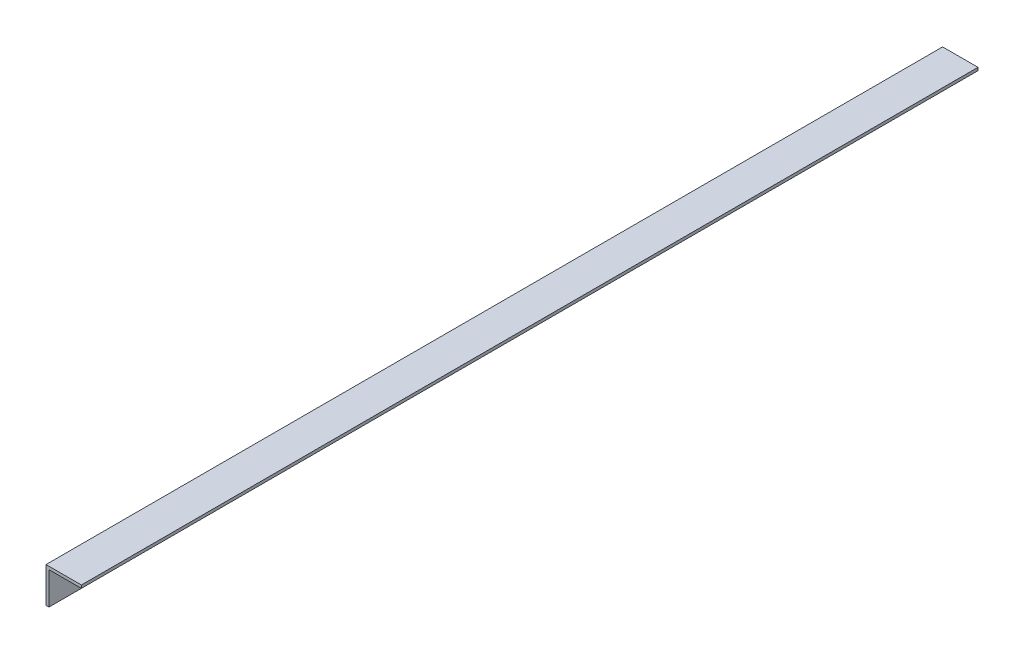
ISO-10303-21;
HEADER;
FILE_DESCRIPTION(('STEP AP214'),'2;1');
FILE_NAME('part.step','',(''),(''),'','','');
FILE_SCHEMA(('AUTOMOTIVE_DESIGN { 1 0 10303 214 1 1 1 1 }'));
ENDSEC;
DATA;
#1=APPLICATION_CONTEXT('core data for automotive mechanical design processes');
#2=APPLICATION_PROTOCOL_DEFINITION('international standard','automotive_design',2000,#1);
#3=PRODUCT_CONTEXT('',#1,'mechanical');
#4=PRODUCT('Part','Part','',(#3));
#5=PRODUCT_RELATED_PRODUCT_CATEGORY('part','',(#4));
#6=PRODUCT_DEFINITION_FORMATION('','',#4);
#7=PRODUCT_DEFINITION_CONTEXT('part definition',#1,'design');
#8=PRODUCT_DEFINITION('design','',#6,#7);
#9=PRODUCT_DEFINITION_SHAPE('','',#8);
#10=(LENGTH_UNIT() NAMED_UNIT(*) SI_UNIT(.MILLI.,.METRE.));
#11=(NAMED_UNIT(*) PLANE_ANGLE_UNIT() SI_UNIT($,.RADIAN.));
#12=(NAMED_UNIT(*) SI_UNIT($,.STERADIAN.) SOLID_ANGLE_UNIT());
#13=UNCERTAINTY_MEASURE_WITH_UNIT(LENGTH_MEASURE(1.E-05),#10,'distance_accuracy_value','');
#14=(GEOMETRIC_REPRESENTATION_CONTEXT(3) GLOBAL_UNCERTAINTY_ASSIGNED_CONTEXT((#13)) GLOBAL_UNIT_ASSIGNED_CONTEXT((#10,
#11,#12)) REPRESENTATION_CONTEXT('',''));
#15=CARTESIAN_POINT('',(0.,0.,0.));
#16=DIRECTION('',(0.,0.,1.));
#17=DIRECTION('',(1.,0.,0.));
#18=AXIS2_PLACEMENT_3D('',#15,#16,#17);
#19=CARTESIAN_POINT('',(6.35,31.75,965.2));
#20=DIRECTION('',(0.,-1.,0.));
#21=DIRECTION('',(0.,0.,-1.));
#22=AXIS2_PLACEMENT_3D('',#19,#20,#21);
#23=PLANE('',#22);
#24=DIRECTION('',(-1.,0.,0.));
#25=VECTOR('',#24,1.);
#26=CARTESIAN_POINT('',(3.175,31.75,965.2));
#27=LINE('',#26,#25);
#28=CARTESIAN_POINT('',(76.2,31.75,965.2));
#29=VERTEX_POINT('',#28);
#30=CARTESIAN_POINT('',(6.35,31.75,965.2));
#31=VERTEX_POINT('',#30);
#32=EDGE_CURVE('E75',#29,#31,#27,.T.);
#33=ORIENTED_EDGE('',*,*,#32,.T.);
#34=DIRECTION('',(0.,0.,-1.));
#35=VECTOR('',#34,1.);
#36=CARTESIAN_POINT('',(6.35,31.75,0.));
#37=LINE('',#36,#35);
#38=CARTESIAN_POINT('',(6.35,31.75,-965.2));
#39=VERTEX_POINT('',#38);
#40=EDGE_CURVE('E19',#39,#31,#37,.F.);
#41=ORIENTED_EDGE('',*,*,#40,.F.);
#42=DIRECTION('',(1.,0.,0.));
#43=VECTOR('',#42,1.);
#44=CARTESIAN_POINT('',(3.175,31.75,-965.2));
#45=LINE('',#44,#43);
#46=CARTESIAN_POINT('',(76.2,31.75,-965.2));
#47=VERTEX_POINT('',#46);
#48=EDGE_CURVE('E72',#39,#47,#45,.T.);
#49=ORIENTED_EDGE('',*,*,#48,.T.);
#50=DIRECTION('',(0.,0.,-1.));
#51=VECTOR('',#50,1.);
#52=CARTESIAN_POINT('',(76.2,31.75,0.));
#53=LINE('',#52,#51);
#54=EDGE_CURVE('E91',#29,#47,#53,.T.);
#55=ORIENTED_EDGE('',*,*,#54,.F.);
#56=EDGE_LOOP('',(#33,#41,#49,#55));
#57=FACE_BOUND('',#56,.T.);
#58=ADVANCED_FACE('F16',(#57),#23,.T.);
#59=CARTESIAN_POINT('',(6.35,0.,0.));
#60=DIRECTION('',(1.,0.,0.));
#61=DIRECTION('',(0.,0.,-1.));
#62=AXIS2_PLACEMENT_3D('',#59,#60,#61);
#63=PLANE('',#62);
#64=DIRECTION('',(0.,1.,0.));
#65=VECTOR('',#64,1.);
#66=CARTESIAN_POINT('',(6.35,0.,-965.2));
#67=LINE('',#66,#65);
#68=CARTESIAN_POINT('',(6.35,-38.1,-965.2));
#69=VERTEX_POINT('',#68);
#70=EDGE_CURVE('E66',#69,#39,#67,.T.);
#71=ORIENTED_EDGE('',*,*,#70,.T.);
#72=ORIENTED_EDGE('',*,*,#40,.T.);
#73=DIRECTION('',(0.,1.,0.));
#74=VECTOR('',#73,1.);
#75=CARTESIAN_POINT('',(6.35,0.,965.2));
#76=LINE('',#75,#74);
#77=CARTESIAN_POINT('',(6.35,-38.1,965.2));
#78=VERTEX_POINT('',#77);
#79=EDGE_CURVE('E98',#31,#78,#76,.F.);
#80=ORIENTED_EDGE('',*,*,#79,.T.);
#81=DIRECTION('',(0.,0.,1.));
#82=VECTOR('',#81,1.);
#83=CARTESIAN_POINT('',(6.35,-38.1,-7.03863634043856E-12));
#84=LINE('',#83,#82);
#85=EDGE_CURVE('E79',#78,#69,#84,.F.);
#86=ORIENTED_EDGE('',*,*,#85,.T.);
#87=EDGE_LOOP('',(#71,#72,#80,#86));
#88=FACE_BOUND('',#87,.T.);
#89=ADVANCED_FACE('F86',(#88),#63,.T.);
#90=CARTESIAN_POINT('',(3.175,-38.1,-7.03863634043856E-12));
#91=DIRECTION('',(0.,1.,0.));
#92=DIRECTION('',(0.,0.,1.));
#93=AXIS2_PLACEMENT_3D('',#90,#91,#92);
#94=PLANE('',#93);
#95=ORIENTED_EDGE('',*,*,#85,.F.);
#96=DIRECTION('',(-1.,0.,0.));
#97=VECTOR('',#96,1.);
#98=CARTESIAN_POINT('',(3.175,-38.1,965.2));
#99=LINE('',#98,#97);
#100=CARTESIAN_POINT('',(0.,-38.1,965.2));
#101=VERTEX_POINT('',#100);
#102=EDGE_CURVE('E100',#78,#101,#99,.T.);
#103=ORIENTED_EDGE('',*,*,#102,.T.);
#104=DIRECTION('',(0.,0.,-1.));
#105=VECTOR('',#104,1.);
#106=CARTESIAN_POINT('',(0.,-38.1,0.));
#107=LINE('',#106,#105);
#108=CARTESIAN_POINT('',(0.,-38.1,-965.2));
#109=VERTEX_POINT('',#108);
#110=EDGE_CURVE('E103',#101,#109,#107,.T.);
#111=ORIENTED_EDGE('',*,*,#110,.T.);
#112=DIRECTION('',(1.,0.,0.));
#113=VECTOR('',#112,1.);
#114=CARTESIAN_POINT('',(3.175,-38.1,-965.2));
#115=LINE('',#114,#113);
#116=EDGE_CURVE('E84',#109,#69,#115,.T.);
#117=ORIENTED_EDGE('',*,*,#116,.T.);
#118=EDGE_LOOP('',(#95,#103,#111,#117));
#119=FACE_BOUND('',#118,.T.);
#120=ADVANCED_FACE('F124',(#119),#94,.F.);
#121=CARTESIAN_POINT('',(3.175,0.,-965.2));
#122=DIRECTION('',(0.,0.,1.));
#123=DIRECTION('',(1.,0.,0.));
#124=AXIS2_PLACEMENT_3D('',#121,#122,#123);
#125=PLANE('',#124);
#126=DIRECTION('',(0.,1.,0.));
#127=VECTOR('',#126,1.);
#128=CARTESIAN_POINT('',(0.,0.,-965.2));
#129=LINE('',#128,#127);
#130=CARTESIAN_POINT('',(0.,38.1,-965.2));
#131=VERTEX_POINT('',#130);
#132=EDGE_CURVE('E106',#109,#131,#129,.T.);
#133=ORIENTED_EDGE('',*,*,#132,.T.);
#134=DIRECTION('',(1.,0.,0.));
#135=VECTOR('',#134,1.);
#136=CARTESIAN_POINT('',(3.175,38.1,-965.2));
#137=LINE('',#136,#135);
#138=CARTESIAN_POINT('',(76.2,38.1,-965.2));
#139=VERTEX_POINT('',#138);
#140=EDGE_CURVE('E108',#131,#139,#137,.T.);
#141=ORIENTED_EDGE('',*,*,#140,.T.);
#142=DIRECTION('',(0.,1.,0.));
#143=VECTOR('',#142,1.);
#144=CARTESIAN_POINT('',(76.2,0.,-965.2));
#145=LINE('',#144,#143);
#146=EDGE_CURVE('E83',#47,#139,#145,.T.);
#147=ORIENTED_EDGE('',*,*,#146,.F.);
#148=ORIENTED_EDGE('',*,*,#48,.F.);
#149=ORIENTED_EDGE('',*,*,#70,.F.);
#150=ORIENTED_EDGE('',*,*,#116,.F.);
#151=EDGE_LOOP('',(#133,#141,#147,#148,#149,#150));
#152=FACE_BOUND('',#151,.T.);
#153=ADVANCED_FACE('F81',(#152),#125,.F.);
#154=CARTESIAN_POINT('',(76.2,0.,0.));
#155=DIRECTION('',(1.,0.,0.));
#156=DIRECTION('',(0.,0.,-1.));
#157=AXIS2_PLACEMENT_3D('',#154,#155,#156);
#158=PLANE('',#157);
#159=ORIENTED_EDGE('',*,*,#146,.T.);
#160=DIRECTION('',(0.,0.,-1.));
#161=VECTOR('',#160,1.);
#162=CARTESIAN_POINT('',(76.2,38.1,-7.03863634043856E-12));
#163=LINE('',#162,#161);
#164=CARTESIAN_POINT('',(76.2,38.1,965.2));
#165=VERTEX_POINT('',#164);
#166=EDGE_CURVE('E110',#139,#165,#163,.F.);
#167=ORIENTED_EDGE('',*,*,#166,.T.);
#168=DIRECTION('',(0.,1.,0.));
#169=VECTOR('',#168,1.);
#170=CARTESIAN_POINT('',(76.2,0.,965.2));
#171=LINE('',#170,#169);
#172=EDGE_CURVE('E94',#165,#29,#171,.F.);
#173=ORIENTED_EDGE('',*,*,#172,.T.);
#174=ORIENTED_EDGE('',*,*,#54,.T.);
#175=EDGE_LOOP('',(#159,#167,#173,#174));
#176=FACE_BOUND('',#175,.T.);
#177=ADVANCED_FACE('F122',(#176),#158,.T.);
#178=CARTESIAN_POINT('',(3.175,0.,965.2));
#179=DIRECTION('',(0.,0.,-1.));
#180=DIRECTION('',(-1.,0.,0.));
#181=AXIS2_PLACEMENT_3D('',#178,#179,#180);
#182=PLANE('',#181);
#183=ORIENTED_EDGE('',*,*,#102,.F.);
#184=ORIENTED_EDGE('',*,*,#79,.F.);
#185=ORIENTED_EDGE('',*,*,#32,.F.);
#186=ORIENTED_EDGE('',*,*,#172,.F.);
#187=DIRECTION('',(1.,0.,0.));
#188=VECTOR('',#187,1.);
#189=CARTESIAN_POINT('',(3.175,38.1,965.2));
#190=LINE('',#189,#188);
#191=CARTESIAN_POINT('',(0.,38.1,965.2));
#192=VERTEX_POINT('',#191);
#193=EDGE_CURVE('E25',#165,#192,#190,.F.);
#194=ORIENTED_EDGE('',*,*,#193,.T.);
#195=DIRECTION('',(0.,1.,0.));
#196=VECTOR('',#195,1.);
#197=CARTESIAN_POINT('',(0.,0.,965.2));
#198=LINE('',#197,#196);
#199=EDGE_CURVE('E33',#192,#101,#198,.F.);
#200=ORIENTED_EDGE('',*,*,#199,.T.);
#201=EDGE_LOOP('',(#183,#184,#185,#186,#194,#200));
#202=FACE_BOUND('',#201,.T.);
#203=ADVANCED_FACE('F117',(#202),#182,.F.);
#204=CARTESIAN_POINT('',(0.,0.,0.));
#205=DIRECTION('',(1.,0.,0.));
#206=DIRECTION('',(0.,0.,-1.));
#207=AXIS2_PLACEMENT_3D('',#204,#205,#206);
#208=PLANE('',#207);
#209=ORIENTED_EDGE('',*,*,#132,.F.);
#210=ORIENTED_EDGE('',*,*,#110,.F.);
#211=ORIENTED_EDGE('',*,*,#199,.F.);
#212=DIRECTION('',(0.,0.,-1.));
#213=VECTOR('',#212,1.);
#214=CARTESIAN_POINT('',(0.,38.1,-7.03863634043856E-12));
#215=LINE('',#214,#213);
#216=EDGE_CURVE('E11',#192,#131,#215,.T.);
#217=ORIENTED_EDGE('',*,*,#216,.T.);
#218=EDGE_LOOP('',(#209,#210,#211,#217));
#219=FACE_BOUND('',#218,.T.);
#220=ADVANCED_FACE('F126',(#219),#208,.F.);
#221=CARTESIAN_POINT('',(3.175,38.1,-7.03863634043856E-12));
#222=DIRECTION('',(0.,-1.,0.));
#223=DIRECTION('',(0.,0.,-1.));
#224=AXIS2_PLACEMENT_3D('',#221,#222,#223);
#225=PLANE('',#224);
#226=ORIENTED_EDGE('',*,*,#193,.F.);
#227=ORIENTED_EDGE('',*,*,#166,.F.);
#228=ORIENTED_EDGE('',*,*,#140,.F.);
#229=ORIENTED_EDGE('',*,*,#216,.F.);
#230=EDGE_LOOP('',(#226,#227,#228,#229));
#231=FACE_BOUND('',#230,.T.);
#232=ADVANCED_FACE('F120',(#231),#225,.F.);
#233=CLOSED_SHELL('',(#58,#89,#120,#153,#177,#203,#220,#232));
#234=MANIFOLD_SOLID_BREP('B1',#233);
#235=ADVANCED_BREP_SHAPE_REPRESENTATION('',(#18,#234),#14);
#236=SHAPE_DEFINITION_REPRESENTATION(#9,#235);
ENDSEC;
END-ISO-10303-21;
